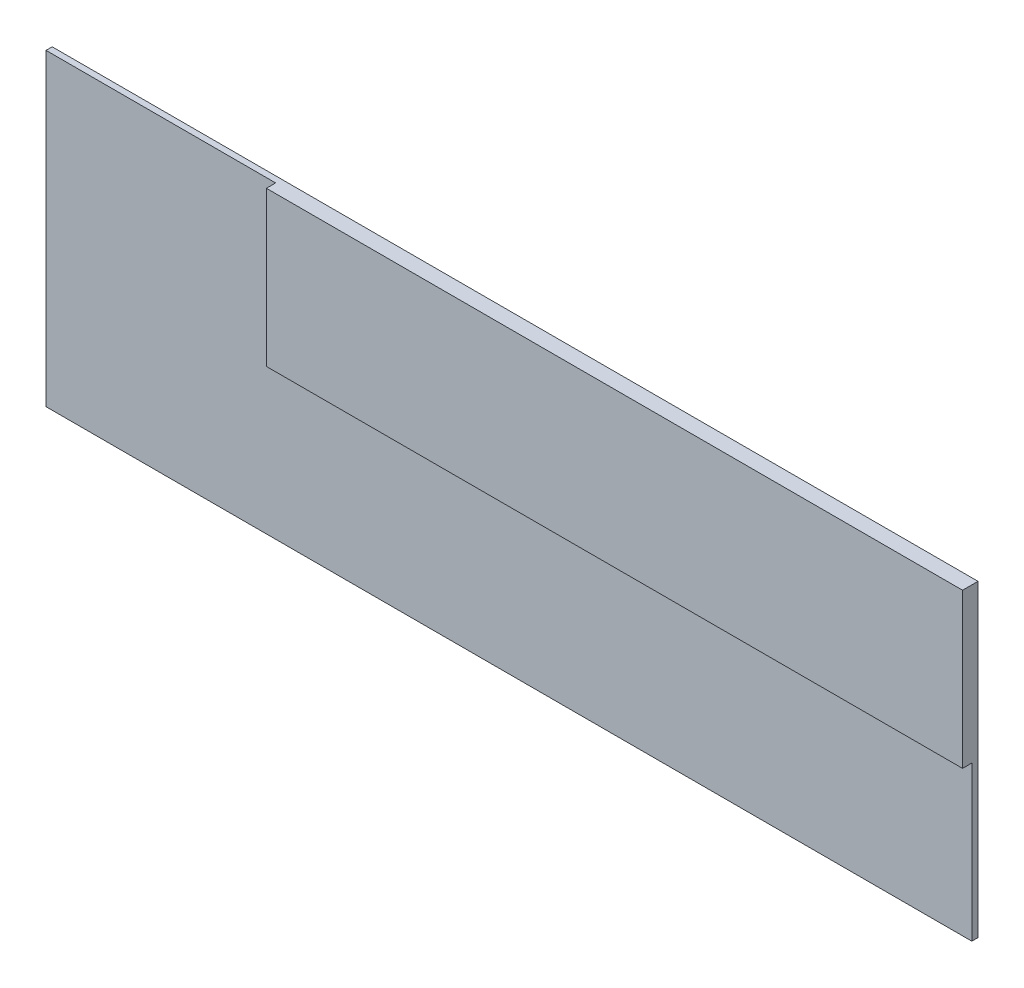
ISO-10303-21;
HEADER;
FILE_DESCRIPTION(('STEP AP214'),'2;1');
FILE_NAME('part.step','',(''),(''),'','','');
FILE_SCHEMA(('AUTOMOTIVE_DESIGN { 1 0 10303 214 1 1 1 1 }'));
ENDSEC;
DATA;
#1=APPLICATION_CONTEXT('core data for automotive mechanical design processes');
#2=APPLICATION_PROTOCOL_DEFINITION('international standard','automotive_design',2000,#1);
#3=PRODUCT_CONTEXT('',#1,'mechanical');
#4=PRODUCT('Part','Part','',(#3));
#5=PRODUCT_RELATED_PRODUCT_CATEGORY('part','',(#4));
#6=PRODUCT_DEFINITION_FORMATION('','',#4);
#7=PRODUCT_DEFINITION_CONTEXT('part definition',#1,'design');
#8=PRODUCT_DEFINITION('design','',#6,#7);
#9=PRODUCT_DEFINITION_SHAPE('','',#8);
#10=(LENGTH_UNIT() NAMED_UNIT(*) SI_UNIT(.MILLI.,.METRE.));
#11=(NAMED_UNIT(*) PLANE_ANGLE_UNIT() SI_UNIT($,.RADIAN.));
#12=(NAMED_UNIT(*) SI_UNIT($,.STERADIAN.) SOLID_ANGLE_UNIT());
#13=UNCERTAINTY_MEASURE_WITH_UNIT(LENGTH_MEASURE(1.E-05),#10,'distance_accuracy_value','');
#14=(GEOMETRIC_REPRESENTATION_CONTEXT(3) GLOBAL_UNCERTAINTY_ASSIGNED_CONTEXT((#13)) GLOBAL_UNIT_ASSIGNED_CONTEXT((#10,
#11,#12)) REPRESENTATION_CONTEXT('',''));
#15=CARTESIAN_POINT('',(0.,0.,0.));
#16=DIRECTION('',(0.,0.,1.));
#17=DIRECTION('',(1.,0.,0.));
#18=AXIS2_PLACEMENT_3D('',#15,#16,#17);
#19=CARTESIAN_POINT('',(12500.,2500.,-100.));
#20=DIRECTION('',(1.,0.,0.));
#21=DIRECTION('',(0.,1.,0.));
#22=AXIS2_PLACEMENT_3D('',#19,#20,#21);
#23=PLANE('',#22);
#24=DIRECTION('',(0.,1.,0.));
#25=VECTOR('',#24,1.);
#26=CARTESIAN_POINT('',(12500.,2500.,0.));
#27=LINE('',#26,#25);
#28=CARTESIAN_POINT('',(12500.,-2500.,0.));
#29=VERTEX_POINT('',#28);
#30=CARTESIAN_POINT('',(12500.,0.,0.));
#31=VERTEX_POINT('',#30);
#32=EDGE_CURVE('E122',#29,#31,#27,.T.);
#33=ORIENTED_EDGE('',*,*,#32,.F.);
#34=DIRECTION('',(0.,0.,1.));
#35=VECTOR('',#34,1.);
#36=CARTESIAN_POINT('',(12500.,-2500.,-100.));
#37=LINE('',#36,#35);
#38=CARTESIAN_POINT('',(12500.,-2500.,-100.));
#39=VERTEX_POINT('',#38);
#40=EDGE_CURVE('E11',#39,#29,#37,.T.);
#41=ORIENTED_EDGE('',*,*,#40,.F.);
#42=DIRECTION('',(0.,1.,0.));
#43=VECTOR('',#42,1.);
#44=CARTESIAN_POINT('',(12500.,2500.,-100.));
#45=LINE('',#44,#43);
#46=CARTESIAN_POINT('',(12500.,2500.,-100.));
#47=VERTEX_POINT('',#46);
#48=EDGE_CURVE('E132',#39,#47,#45,.T.);
#49=ORIENTED_EDGE('',*,*,#48,.T.);
#50=DIRECTION('',(0.,0.,1.));
#51=VECTOR('',#50,1.);
#52=CARTESIAN_POINT('',(12500.,2500.,-100.));
#53=LINE('',#52,#51);
#54=CARTESIAN_POINT('',(12500.,2500.,150.));
#55=VERTEX_POINT('',#54);
#56=EDGE_CURVE('E42',#47,#55,#53,.T.);
#57=ORIENTED_EDGE('',*,*,#56,.T.);
#58=DIRECTION('',(0.,1.,0.));
#59=VECTOR('',#58,1.);
#60=CARTESIAN_POINT('',(12500.,0.,150.));
#61=LINE('',#60,#59);
#62=CARTESIAN_POINT('',(12500.,0.,150.));
#63=VERTEX_POINT('',#62);
#64=EDGE_CURVE('E108',#63,#55,#61,.T.);
#65=ORIENTED_EDGE('',*,*,#64,.F.);
#66=DIRECTION('',(0.,0.,-1.));
#67=VECTOR('',#66,1.);
#68=CARTESIAN_POINT('',(12500.,0.,150.));
#69=LINE('',#68,#67);
#70=EDGE_CURVE('E103',#63,#31,#69,.T.);
#71=ORIENTED_EDGE('',*,*,#70,.T.);
#72=EDGE_LOOP('',(#33,#41,#49,#57,#65,#71));
#73=FACE_BOUND('',#72,.T.);
#74=ADVANCED_FACE('F39',(#73),#23,.T.);
#75=CARTESIAN_POINT('',(-2500.,-2500.,-100.));
#76=DIRECTION('',(0.,-1.,0.));
#77=DIRECTION('',(1.,0.,0.));
#78=AXIS2_PLACEMENT_3D('',#75,#76,#77);
#79=PLANE('',#78);
#80=DIRECTION('',(1.,0.,0.));
#81=VECTOR('',#80,1.);
#82=CARTESIAN_POINT('',(-2500.,-2500.,0.));
#83=LINE('',#82,#81);
#84=CARTESIAN_POINT('',(-2500.,-2500.,0.));
#85=VERTEX_POINT('',#84);
#86=EDGE_CURVE('E137',#85,#29,#83,.T.);
#87=ORIENTED_EDGE('',*,*,#86,.F.);
#88=DIRECTION('',(0.,0.,1.));
#89=VECTOR('',#88,1.);
#90=CARTESIAN_POINT('',(-2500.,-2500.,-100.));
#91=LINE('',#90,#89);
#92=CARTESIAN_POINT('',(-2500.,-2500.,-100.));
#93=VERTEX_POINT('',#92);
#94=EDGE_CURVE('E48',#93,#85,#91,.T.);
#95=ORIENTED_EDGE('',*,*,#94,.F.);
#96=DIRECTION('',(1.,0.,0.));
#97=VECTOR('',#96,1.);
#98=CARTESIAN_POINT('',(-2500.,-2500.,-100.));
#99=LINE('',#98,#97);
#100=EDGE_CURVE('E145',#93,#39,#99,.T.);
#101=ORIENTED_EDGE('',*,*,#100,.T.);
#102=ORIENTED_EDGE('',*,*,#40,.T.);
#103=EDGE_LOOP('',(#87,#95,#101,#102));
#104=FACE_BOUND('',#103,.T.);
#105=ADVANCED_FACE('F182',(#104),#79,.T.);
#106=CARTESIAN_POINT('',(-2500.,2500.,-100.));
#107=DIRECTION('',(-1.,0.,0.));
#108=DIRECTION('',(0.,0.,1.));
#109=AXIS2_PLACEMENT_3D('',#106,#107,#108);
#110=PLANE('',#109);
#111=DIRECTION('',(0.,-1.,0.));
#112=VECTOR('',#111,1.);
#113=CARTESIAN_POINT('',(-2500.,2500.,0.));
#114=LINE('',#113,#112);
#115=CARTESIAN_POINT('',(-2500.,2500.,0.));
#116=VERTEX_POINT('',#115);
#117=EDGE_CURVE('E151',#116,#85,#114,.T.);
#118=ORIENTED_EDGE('',*,*,#117,.F.);
#119=DIRECTION('',(0.,0.,1.));
#120=VECTOR('',#119,1.);
#121=CARTESIAN_POINT('',(-2500.,2500.,-100.));
#122=LINE('',#121,#120);
#123=CARTESIAN_POINT('',(-2500.,2500.,-100.));
#124=VERTEX_POINT('',#123);
#125=EDGE_CURVE('E159',#124,#116,#122,.T.);
#126=ORIENTED_EDGE('',*,*,#125,.F.);
#127=DIRECTION('',(0.,-1.,0.));
#128=VECTOR('',#127,1.);
#129=CARTESIAN_POINT('',(-2500.,2500.,-100.));
#130=LINE('',#129,#128);
#131=EDGE_CURVE('E141',#124,#93,#130,.T.);
#132=ORIENTED_EDGE('',*,*,#131,.T.);
#133=ORIENTED_EDGE('',*,*,#94,.T.);
#134=EDGE_LOOP('',(#118,#126,#132,#133));
#135=FACE_BOUND('',#134,.T.);
#136=ADVANCED_FACE('F188',(#135),#110,.T.);
#137=CARTESIAN_POINT('',(-2500.,2500.,-100.));
#138=DIRECTION('',(0.,1.,0.));
#139=DIRECTION('',(-1.,0.,0.));
#140=AXIS2_PLACEMENT_3D('',#137,#138,#139);
#141=PLANE('',#140);
#142=DIRECTION('',(-1.,0.,0.));
#143=VECTOR('',#142,1.);
#144=CARTESIAN_POINT('',(-2500.,2500.,0.));
#145=LINE('',#144,#143);
#146=CARTESIAN_POINT('',(1220.81995892335,2500.,0.));
#147=VERTEX_POINT('',#146);
#148=EDGE_CURVE('E126',#147,#116,#145,.T.);
#149=ORIENTED_EDGE('',*,*,#148,.F.);
#150=DIRECTION('',(0.,0.,-1.));
#151=VECTOR('',#150,1.);
#152=CARTESIAN_POINT('',(1220.81995892335,2500.,150.));
#153=LINE('',#152,#151);
#154=CARTESIAN_POINT('',(1220.81995892335,2500.,150.));
#155=VERTEX_POINT('',#154);
#156=EDGE_CURVE('E128',#155,#147,#153,.T.);
#157=ORIENTED_EDGE('',*,*,#156,.F.);
#158=DIRECTION('',(-1.,0.,0.));
#159=VECTOR('',#158,1.);
#160=CARTESIAN_POINT('',(1220.81995892335,2500.,150.));
#161=LINE('',#160,#159);
#162=EDGE_CURVE('E114',#55,#155,#161,.T.);
#163=ORIENTED_EDGE('',*,*,#162,.F.);
#164=ORIENTED_EDGE('',*,*,#56,.F.);
#165=DIRECTION('',(-1.,0.,0.));
#166=VECTOR('',#165,1.);
#167=CARTESIAN_POINT('',(-2500.,2500.,-100.));
#168=LINE('',#167,#166);
#169=EDGE_CURVE('E136',#47,#124,#168,.T.);
#170=ORIENTED_EDGE('',*,*,#169,.T.);
#171=ORIENTED_EDGE('',*,*,#125,.T.);
#172=EDGE_LOOP('',(#149,#157,#163,#164,#170,#171));
#173=FACE_BOUND('',#172,.T.);
#174=ADVANCED_FACE('F171',(#173),#141,.T.);
#175=CARTESIAN_POINT('',(0.,0.,-100.));
#176=DIRECTION('',(0.,0.,1.));
#177=DIRECTION('',(1.,0.,0.));
#178=AXIS2_PLACEMENT_3D('',#175,#176,#177);
#179=PLANE('',#178);
#180=ORIENTED_EDGE('',*,*,#48,.F.);
#181=ORIENTED_EDGE('',*,*,#100,.F.);
#182=ORIENTED_EDGE('',*,*,#131,.F.);
#183=ORIENTED_EDGE('',*,*,#169,.F.);
#184=EDGE_LOOP('',(#180,#181,#182,#183));
#185=FACE_BOUND('',#184,.T.);
#186=ADVANCED_FACE('F186',(#185),#179,.F.);
#187=CARTESIAN_POINT('',(0.,0.,0.));
#188=DIRECTION('',(0.,0.,1.));
#189=DIRECTION('',(1.,0.,0.));
#190=AXIS2_PLACEMENT_3D('',#187,#188,#189);
#191=PLANE('',#190);
#192=DIRECTION('',(0.,-1.,0.));
#193=VECTOR('',#192,1.);
#194=CARTESIAN_POINT('',(1220.81995892335,0.,0.));
#195=LINE('',#194,#193);
#196=CARTESIAN_POINT('',(1220.81995892335,0.,0.));
#197=VERTEX_POINT('',#196);
#198=EDGE_CURVE('E61',#147,#197,#195,.T.);
#199=ORIENTED_EDGE('',*,*,#198,.F.);
#200=ORIENTED_EDGE('',*,*,#148,.T.);
#201=ORIENTED_EDGE('',*,*,#117,.T.);
#202=ORIENTED_EDGE('',*,*,#86,.T.);
#203=ORIENTED_EDGE('',*,*,#32,.T.);
#204=DIRECTION('',(1.,0.,0.));
#205=VECTOR('',#204,1.);
#206=CARTESIAN_POINT('',(1220.81995892335,0.,0.));
#207=LINE('',#206,#205);
#208=EDGE_CURVE('E56',#197,#31,#207,.T.);
#209=ORIENTED_EDGE('',*,*,#208,.F.);
#210=EDGE_LOOP('',(#199,#200,#201,#202,#203,#209));
#211=FACE_BOUND('',#210,.T.);
#212=ADVANCED_FACE('F180',(#211),#191,.T.);
#213=CARTESIAN_POINT('',(1220.81995892335,0.,150.));
#214=DIRECTION('',(1.,0.,0.));
#215=DIRECTION('',(0.,0.,-1.));
#216=AXIS2_PLACEMENT_3D('',#213,#214,#215);
#217=PLANE('',#216);
#218=ORIENTED_EDGE('',*,*,#198,.T.);
#219=DIRECTION('',(0.,0.,-1.));
#220=VECTOR('',#219,1.);
#221=CARTESIAN_POINT('',(1220.81995892335,0.,150.));
#222=LINE('',#221,#220);
#223=CARTESIAN_POINT('',(1220.81995892335,0.,150.));
#224=VERTEX_POINT('',#223);
#225=EDGE_CURVE('E101',#224,#197,#222,.T.);
#226=ORIENTED_EDGE('',*,*,#225,.F.);
#227=DIRECTION('',(0.,-1.,0.));
#228=VECTOR('',#227,1.);
#229=CARTESIAN_POINT('',(1220.81995892335,0.,150.));
#230=LINE('',#229,#228);
#231=EDGE_CURVE('E109',#155,#224,#230,.T.);
#232=ORIENTED_EDGE('',*,*,#231,.F.);
#233=ORIENTED_EDGE('',*,*,#156,.T.);
#234=EDGE_LOOP('',(#218,#226,#232,#233));
#235=FACE_BOUND('',#234,.T.);
#236=ADVANCED_FACE('F120',(#235),#217,.F.);
#237=CARTESIAN_POINT('',(1220.81995892335,0.,150.));
#238=DIRECTION('',(0.,1.,0.));
#239=DIRECTION('',(0.,0.,1.));
#240=AXIS2_PLACEMENT_3D('',#237,#238,#239);
#241=PLANE('',#240);
#242=ORIENTED_EDGE('',*,*,#208,.T.);
#243=ORIENTED_EDGE('',*,*,#70,.F.);
#244=DIRECTION('',(1.,0.,0.));
#245=VECTOR('',#244,1.);
#246=CARTESIAN_POINT('',(1220.81995892335,0.,150.));
#247=LINE('',#246,#245);
#248=EDGE_CURVE('E97',#224,#63,#247,.T.);
#249=ORIENTED_EDGE('',*,*,#248,.F.);
#250=ORIENTED_EDGE('',*,*,#225,.T.);
#251=EDGE_LOOP('',(#242,#243,#249,#250));
#252=FACE_BOUND('',#251,.T.);
#253=ADVANCED_FACE('F99',(#252),#241,.F.);
#254=CARTESIAN_POINT('',(0.,0.,150.));
#255=DIRECTION('',(0.,0.,-1.));
#256=DIRECTION('',(-1.,0.,0.));
#257=AXIS2_PLACEMENT_3D('',#254,#255,#256);
#258=PLANE('',#257);
#259=ORIENTED_EDGE('',*,*,#231,.T.);
#260=ORIENTED_EDGE('',*,*,#248,.T.);
#261=ORIENTED_EDGE('',*,*,#64,.T.);
#262=ORIENTED_EDGE('',*,*,#162,.T.);
#263=EDGE_LOOP('',(#259,#260,#261,#262));
#264=FACE_BOUND('',#263,.T.);
#265=ADVANCED_FACE('F112',(#264),#258,.F.);
#266=CLOSED_SHELL('',(#74,#105,#136,#174,#186,#212,#236,#253,#265));
#267=MANIFOLD_SOLID_BREP('B2',#266);
#268=ADVANCED_BREP_SHAPE_REPRESENTATION('',(#18,#267),#14);
#269=SHAPE_DEFINITION_REPRESENTATION(#9,#268);
ENDSEC;
END-ISO-10303-21;
